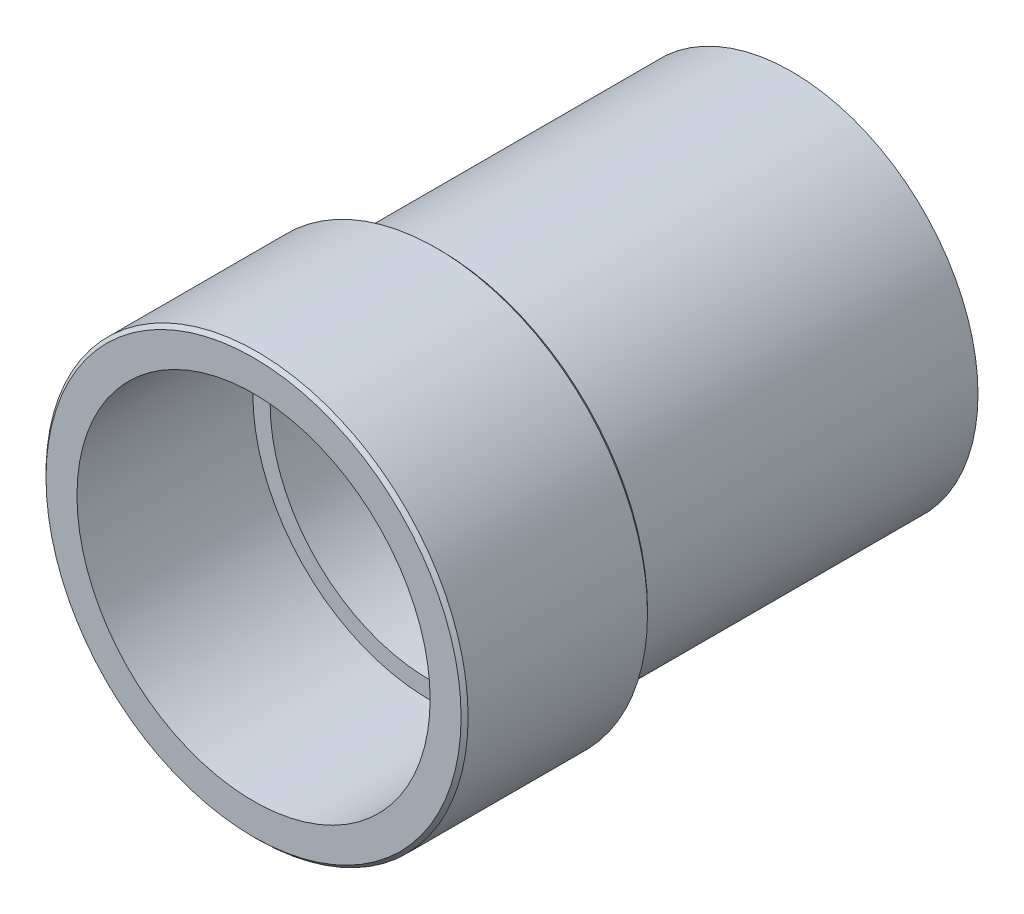
ISO-10303-21;
HEADER;
FILE_DESCRIPTION(('STEP AP214'),'2;1');
FILE_NAME('part.step','',(''),(''),'','','');
FILE_SCHEMA(('AUTOMOTIVE_DESIGN { 1 0 10303 214 1 1 1 1 }'));
ENDSEC;
DATA;
#1=APPLICATION_CONTEXT('core data for automotive mechanical design processes');
#2=APPLICATION_PROTOCOL_DEFINITION('international standard','automotive_design',2000,#1);
#3=PRODUCT_CONTEXT('',#1,'mechanical');
#4=PRODUCT('Part','Part','',(#3));
#5=PRODUCT_RELATED_PRODUCT_CATEGORY('part','',(#4));
#6=PRODUCT_DEFINITION_FORMATION('','',#4);
#7=PRODUCT_DEFINITION_CONTEXT('part definition',#1,'design');
#8=PRODUCT_DEFINITION('design','',#6,#7);
#9=PRODUCT_DEFINITION_SHAPE('','',#8);
#10=(LENGTH_UNIT() NAMED_UNIT(*) SI_UNIT(.MILLI.,.METRE.));
#11=(NAMED_UNIT(*) PLANE_ANGLE_UNIT() SI_UNIT($,.RADIAN.));
#12=(NAMED_UNIT(*) SI_UNIT($,.STERADIAN.) SOLID_ANGLE_UNIT());
#13=UNCERTAINTY_MEASURE_WITH_UNIT(LENGTH_MEASURE(1.E-05),#10,'distance_accuracy_value','');
#14=(GEOMETRIC_REPRESENTATION_CONTEXT(3) GLOBAL_UNCERTAINTY_ASSIGNED_CONTEXT((#13)) GLOBAL_UNIT_ASSIGNED_CONTEXT((#10,
#11,#12)) REPRESENTATION_CONTEXT('',''));
#15=CARTESIAN_POINT('',(0.,0.,0.));
#16=DIRECTION('',(0.,0.,1.));
#17=DIRECTION('',(1.,0.,0.));
#18=AXIS2_PLACEMENT_3D('',#15,#16,#17);
#19=CARTESIAN_POINT('',(0.,12.461875,-12.7));
#20=DIRECTION('',(0.,0.,1.));
#21=DIRECTION('',(1.,0.,0.));
#22=AXIS2_PLACEMENT_3D('',#19,#20,#21);
#23=PLANE('',#22);
#24=CARTESIAN_POINT('',(0.,0.396874999999997,-12.7));
#25=DIRECTION('',(0.,0.,1.));
#26=DIRECTION('',(1.,0.,0.));
#27=AXIS2_PLACEMENT_3D('',#24,#25,#26);
#28=CIRCLE('',#27,12.75);
#29=CARTESIAN_POINT('',(12.75,0.396874999999997,-12.7));
#30=VERTEX_POINT('',#29);
#31=EDGE_CURVE('E43',#30,#30,#28,.T.);
#32=ORIENTED_EDGE('',*,*,#31,.T.);
#33=EDGE_LOOP('',(#32));
#34=FACE_BOUND('',#33,.T.);
#35=CARTESIAN_POINT('',(0.,0.396874999999996,-12.7));
#36=DIRECTION('',(0.,0.,1.));
#37=DIRECTION('',(1.,0.,0.));
#38=AXIS2_PLACEMENT_3D('',#35,#36,#37);
#39=CIRCLE('',#38,11.5);
#40=CARTESIAN_POINT('',(11.5,0.396874999999996,-12.7));
#41=VERTEX_POINT('',#40);
#42=EDGE_CURVE('E75',#41,#41,#39,.T.);
#43=ORIENTED_EDGE('',*,*,#42,.F.);
#44=EDGE_LOOP('',(#43));
#45=FACE_BOUND('',#44,.T.);
#46=ADVANCED_FACE('F39',(#34,#45),#23,.T.);
#47=CARTESIAN_POINT('',(0.,0.396874999999997,0.));
#48=DIRECTION('',(0.,0.,1.));
#49=DIRECTION('',(1.,0.,0.));
#50=AXIS2_PLACEMENT_3D('',#47,#48,#49);
#51=CYLINDRICAL_SURFACE('',#50,15.24);
#52=CARTESIAN_POINT('',(0.,0.396874999999997,-0.254000000000004));
#53=DIRECTION('',(0.,0.,1.));
#54=DIRECTION('',(1.,0.,0.));
#55=AXIS2_PLACEMENT_3D('',#52,#53,#54);
#56=CIRCLE('',#55,15.24);
#57=CARTESIAN_POINT('',(15.24,0.396874999999998,-0.254000000000006));
#58=VERTEX_POINT('',#57);
#59=EDGE_CURVE('E52',#58,#58,#56,.F.);
#60=ORIENTED_EDGE('',*,*,#59,.T.);
#61=EDGE_LOOP('',(#60));
#62=FACE_BOUND('',#61,.T.);
#63=CARTESIAN_POINT('',(0.,0.396874999999997,-13.208));
#64=DIRECTION('',(0.,0.,-1.));
#65=DIRECTION('',(-1.,0.,0.));
#66=AXIS2_PLACEMENT_3D('',#63,#64,#65);
#67=CIRCLE('',#66,15.24);
#68=CARTESIAN_POINT('',(-15.24,0.396874999999997,-13.208));
#69=VERTEX_POINT('',#68);
#70=EDGE_CURVE('E58',#69,#69,#67,.F.);
#71=ORIENTED_EDGE('',*,*,#70,.T.);
#72=EDGE_LOOP('',(#71));
#73=FACE_BOUND('',#72,.T.);
#74=ADVANCED_FACE('F82',(#62,#73),#51,.T.);
#75=CARTESIAN_POINT('',(0.,15.636875,-13.462));
#76=DIRECTION('',(0.,0.,-1.));
#77=DIRECTION('',(-1.,0.,0.));
#78=AXIS2_PLACEMENT_3D('',#75,#76,#77);
#79=PLANE('',#78);
#80=CARTESIAN_POINT('',(0.,0.396874999999997,-13.462));
#81=DIRECTION('',(0.,0.,-1.));
#82=DIRECTION('',(-1.,0.,0.));
#83=AXIS2_PLACEMENT_3D('',#80,#81,#82);
#84=CIRCLE('',#83,13.45);
#85=CARTESIAN_POINT('',(-13.45,0.396874999999997,-13.462));
#86=VERTEX_POINT('',#85);
#87=EDGE_CURVE('E10',#86,#86,#84,.T.);
#88=ORIENTED_EDGE('',*,*,#87,.F.);
#89=EDGE_LOOP('',(#88));
#90=FACE_BOUND('',#89,.T.);
#91=CARTESIAN_POINT('',(0.,0.396874999999997,-13.462));
#92=DIRECTION('',(0.,0.,-1.));
#93=DIRECTION('',(-1.,0.,0.));
#94=AXIS2_PLACEMENT_3D('',#91,#92,#93);
#95=CIRCLE('',#94,14.986);
#96=CARTESIAN_POINT('',(-14.986,0.396874999999997,-13.462));
#97=VERTEX_POINT('',#96);
#98=EDGE_CURVE('E47',#97,#97,#95,.T.);
#99=ORIENTED_EDGE('',*,*,#98,.T.);
#100=EDGE_LOOP('',(#99));
#101=FACE_BOUND('',#100,.T.);
#102=ADVANCED_FACE('F90',(#90,#101),#79,.T.);
#103=CARTESIAN_POINT('',(0.,0.396874999999997,0.));
#104=DIRECTION('',(0.,0.,-1.));
#105=DIRECTION('',(-1.,0.,0.));
#106=AXIS2_PLACEMENT_3D('',#103,#104,#105);
#107=CONICAL_SURFACE('',#106,14.986,0.785398163397455);
#108=ORIENTED_EDGE('',*,*,#59,.F.);
#109=EDGE_LOOP('',(#108));
#110=FACE_BOUND('',#109,.T.);
#111=CARTESIAN_POINT('',(0.,0.396874999999997,0.));
#112=DIRECTION('',(0.,0.,1.));
#113=DIRECTION('',(1.,0.,0.));
#114=AXIS2_PLACEMENT_3D('',#111,#112,#113);
#115=CIRCLE('',#114,14.986);
#116=CARTESIAN_POINT('',(14.986,0.396874999999998,0.));
#117=VERTEX_POINT('',#116);
#118=EDGE_CURVE('E62',#117,#117,#115,.T.);
#119=ORIENTED_EDGE('',*,*,#118,.F.);
#120=EDGE_LOOP('',(#119));
#121=FACE_BOUND('',#120,.T.);
#122=ADVANCED_FACE('F104',(#110,#121),#107,.T.);
#123=CARTESIAN_POINT('',(0.,0.396874999999997,-13.208));
#124=DIRECTION('',(0.,0.,1.));
#125=DIRECTION('',(1.,0.,0.));
#126=AXIS2_PLACEMENT_3D('',#123,#124,#125);
#127=CONICAL_SURFACE('',#126,15.24,0.785398163397459);
#128=ORIENTED_EDGE('',*,*,#98,.F.);
#129=EDGE_LOOP('',(#128));
#130=FACE_BOUND('',#129,.T.);
#131=ORIENTED_EDGE('',*,*,#70,.F.);
#132=EDGE_LOOP('',(#131));
#133=FACE_BOUND('',#132,.T.);
#134=ADVANCED_FACE('F41',(#130,#133),#127,.T.);
#135=CARTESIAN_POINT('',(0.,15.636875,0.));
#136=DIRECTION('',(0.,0.,1.));
#137=DIRECTION('',(1.,0.,0.));
#138=AXIS2_PLACEMENT_3D('',#135,#136,#137);
#139=PLANE('',#138);
#140=ORIENTED_EDGE('',*,*,#118,.T.);
#141=EDGE_LOOP('',(#140));
#142=FACE_BOUND('',#141,.T.);
#143=CARTESIAN_POINT('',(0.,0.396874999999997,0.));
#144=DIRECTION('',(0.,0.,1.));
#145=DIRECTION('',(1.,0.,0.));
#146=AXIS2_PLACEMENT_3D('',#143,#144,#145);
#147=CIRCLE('',#146,12.75);
#148=CARTESIAN_POINT('',(12.75,0.396874999999997,0.));
#149=VERTEX_POINT('',#148);
#150=EDGE_CURVE('E72',#149,#149,#147,.T.);
#151=ORIENTED_EDGE('',*,*,#150,.F.);
#152=EDGE_LOOP('',(#151));
#153=FACE_BOUND('',#152,.T.);
#154=ADVANCED_FACE('F107',(#142,#153),#139,.T.);
#155=CARTESIAN_POINT('',(0.,0.396874999999999,24.5803448278363));
#156=DIRECTION('',(0.,0.,-1.));
#157=DIRECTION('',(-1.,0.,0.));
#158=AXIS2_PLACEMENT_3D('',#155,#156,#157);
#159=CYLINDRICAL_SURFACE('',#158,13.45);
#160=ORIENTED_EDGE('',*,*,#87,.T.);
#161=EDGE_LOOP('',(#160));
#162=FACE_BOUND('',#161,.T.);
#163=CARTESIAN_POINT('',(0.,0.396874999999996,-38.862));
#164=DIRECTION('',(0.,0.,-1.));
#165=DIRECTION('',(-1.,0.,0.));
#166=AXIS2_PLACEMENT_3D('',#163,#164,#165);
#167=CIRCLE('',#166,13.45);
#168=CARTESIAN_POINT('',(-13.45,0.396874999999996,-38.862));
#169=VERTEX_POINT('',#168);
#170=EDGE_CURVE('E66',#169,#169,#167,.T.);
#171=ORIENTED_EDGE('',*,*,#170,.F.);
#172=EDGE_LOOP('',(#171));
#173=FACE_BOUND('',#172,.T.);
#174=ADVANCED_FACE('F96',(#162,#173),#159,.T.);
#175=CARTESIAN_POINT('',(0.,0.396874999999999,24.5803448278363));
#176=DIRECTION('',(0.,0.,-1.));
#177=DIRECTION('',(-1.,0.,0.));
#178=AXIS2_PLACEMENT_3D('',#175,#176,#177);
#179=CYLINDRICAL_SURFACE('',#178,11.5);
#180=CARTESIAN_POINT('',(0.,0.396874999999996,-38.862));
#181=DIRECTION('',(0.,0.,-1.));
#182=DIRECTION('',(-1.,0.,0.));
#183=AXIS2_PLACEMENT_3D('',#180,#181,#182);
#184=CIRCLE('',#183,11.5);
#185=CARTESIAN_POINT('',(-11.5,0.396874999999996,-38.862));
#186=VERTEX_POINT('',#185);
#187=EDGE_CURVE('E69',#186,#186,#184,.T.);
#188=ORIENTED_EDGE('',*,*,#187,.T.);
#189=EDGE_LOOP('',(#188));
#190=FACE_BOUND('',#189,.T.);
#191=ORIENTED_EDGE('',*,*,#42,.T.);
#192=EDGE_LOOP('',(#191));
#193=FACE_BOUND('',#192,.T.);
#194=ADVANCED_FACE('F79',(#190,#193),#179,.F.);
#195=CARTESIAN_POINT('',(0.,13.541375,-38.862));
#196=DIRECTION('',(0.,0.,-1.));
#197=DIRECTION('',(-1.,0.,0.));
#198=AXIS2_PLACEMENT_3D('',#195,#196,#197);
#199=PLANE('',#198);
#200=ORIENTED_EDGE('',*,*,#170,.T.);
#201=EDGE_LOOP('',(#200));
#202=FACE_BOUND('',#201,.T.);
#203=ORIENTED_EDGE('',*,*,#187,.F.);
#204=EDGE_LOOP('',(#203));
#205=FACE_BOUND('',#204,.T.);
#206=ADVANCED_FACE('F98',(#202,#205),#199,.T.);
#207=CARTESIAN_POINT('',(0.,0.396874999999997,-55.8488088914464));
#208=DIRECTION('',(0.,0.,1.));
#209=DIRECTION('',(1.,0.,0.));
#210=AXIS2_PLACEMENT_3D('',#207,#208,#209);
#211=CYLINDRICAL_SURFACE('',#210,12.75);
#212=CARTESIAN_POINT('',(12.75,0.396874999999997,-12.7));
#213=CARTESIAN_POINT('',(12.75,0.396874999999997,-12.5677083333333));
#214=CARTESIAN_POINT('',(12.75,0.396874999999997,-12.4354166666667));
#215=CARTESIAN_POINT('',(12.75,0.396874999999997,-12.1708333333333));
#216=CARTESIAN_POINT('',(12.75,0.396874999999997,-12.0385416666667));
#217=CARTESIAN_POINT('',(12.75,0.396874999999997,-11.7739583333333));
#218=CARTESIAN_POINT('',(12.75,0.396874999999997,-11.6416666666667));
#219=CARTESIAN_POINT('',(12.75,0.396874999999997,-11.3770833333333));
#220=CARTESIAN_POINT('',(12.75,0.396874999999997,-11.2447916666667));
#221=CARTESIAN_POINT('',(12.75,0.396874999999997,-10.9802083333333));
#222=CARTESIAN_POINT('',(12.75,0.396874999999997,-10.8479166666667));
#223=CARTESIAN_POINT('',(12.75,0.396874999999997,-10.5833333333333));
#224=CARTESIAN_POINT('',(12.75,0.396874999999997,-10.4510416666667));
#225=CARTESIAN_POINT('',(12.75,0.396874999999997,-10.1864583333333));
#226=CARTESIAN_POINT('',(12.75,0.396874999999997,-10.0541666666667));
#227=CARTESIAN_POINT('',(12.75,0.396874999999997,-9.78958333333335));
#228=CARTESIAN_POINT('',(12.75,0.396874999999997,-9.65729166666668));
#229=CARTESIAN_POINT('',(12.75,0.396874999999997,-9.39270833333335));
#230=CARTESIAN_POINT('',(12.75,0.396874999999997,-9.26041666666667));
#231=CARTESIAN_POINT('',(12.75,0.396874999999997,-8.99583333333334));
#232=CARTESIAN_POINT('',(12.75,0.396874999999997,-8.86354166666668));
#233=CARTESIAN_POINT('',(12.75,0.396874999999997,-8.59895833333334));
#234=CARTESIAN_POINT('',(12.75,0.396874999999997,-8.46666666666668));
#235=CARTESIAN_POINT('',(12.75,0.396874999999997,-8.20208333333334));
#236=CARTESIAN_POINT('',(12.75,0.396874999999997,-8.06979166666667));
#237=CARTESIAN_POINT('',(12.75,0.396874999999997,-7.80520833333334));
#238=CARTESIAN_POINT('',(12.75,0.396874999999997,-7.67291666666668));
#239=CARTESIAN_POINT('',(12.75,0.396874999999997,-7.40833333333334));
#240=CARTESIAN_POINT('',(12.75,0.396874999999997,-7.27604166666668));
#241=CARTESIAN_POINT('',(12.75,0.396874999999997,-7.01145833333334));
#242=CARTESIAN_POINT('',(12.75,0.396874999999997,-6.87916666666668));
#243=CARTESIAN_POINT('',(12.75,0.396874999999997,-6.61458333333334));
#244=CARTESIAN_POINT('',(12.75,0.396874999999997,-6.48229166666667));
#245=CARTESIAN_POINT('',(12.75,0.396874999999997,-6.21770833333334));
#246=CARTESIAN_POINT('',(12.75,0.396874999999997,-6.08541666666668));
#247=CARTESIAN_POINT('',(12.75,0.396874999999997,-5.82083333333334));
#248=CARTESIAN_POINT('',(12.75,0.396874999999997,-5.68854166666667));
#249=CARTESIAN_POINT('',(12.75,0.396874999999997,-5.42395833333334));
#250=CARTESIAN_POINT('',(12.75,0.396874999999997,-5.29166666666667));
#251=CARTESIAN_POINT('',(12.75,0.396874999999997,-5.02708333333334));
#252=CARTESIAN_POINT('',(12.75,0.396874999999997,-4.89479166666668));
#253=CARTESIAN_POINT('',(12.75,0.396874999999997,-4.63020833333334));
#254=CARTESIAN_POINT('',(12.75,0.396874999999997,-4.49791666666667));
#255=CARTESIAN_POINT('',(12.75,0.396874999999997,-4.23333333333334));
#256=CARTESIAN_POINT('',(12.75,0.396874999999997,-4.10104166666667));
#257=CARTESIAN_POINT('',(12.75,0.396874999999997,-3.83645833333334));
#258=CARTESIAN_POINT('',(12.75,0.396874999999997,-3.70416666666668));
#259=CARTESIAN_POINT('',(12.75,0.396874999999997,-3.43958333333334));
#260=CARTESIAN_POINT('',(12.75,0.396874999999997,-3.30729166666667));
#261=CARTESIAN_POINT('',(12.75,0.396874999999997,-3.04270833333334));
#262=CARTESIAN_POINT('',(12.75,0.396874999999997,-2.91041666666667));
#263=CARTESIAN_POINT('',(12.75,0.396874999999997,-2.64583333333334));
#264=CARTESIAN_POINT('',(12.75,0.396874999999997,-2.51354166666667));
#265=CARTESIAN_POINT('',(12.75,0.396874999999997,-2.24895833333334));
#266=CARTESIAN_POINT('',(12.75,0.396874999999997,-2.11666666666667));
#267=CARTESIAN_POINT('',(12.75,0.396874999999997,-1.85208333333334));
#268=CARTESIAN_POINT('',(12.75,0.396874999999997,-1.71979166666667));
#269=CARTESIAN_POINT('',(12.75,0.396874999999997,-1.45520833333334));
#270=CARTESIAN_POINT('',(12.75,0.396874999999997,-1.32291666666667));
#271=CARTESIAN_POINT('',(12.75,0.396874999999997,-1.05833333333334));
#272=CARTESIAN_POINT('',(12.75,0.396874999999997,-0.926041666666671));
#273=CARTESIAN_POINT('',(12.75,0.396874999999997,-0.661458333333337));
#274=CARTESIAN_POINT('',(12.75,0.396874999999997,-0.529166666666671));
#275=CARTESIAN_POINT('',(12.75,0.396874999999997,-0.264583333333339));
#276=CARTESIAN_POINT('',(12.75,0.396874999999997,-0.132291666666673));
#277=CARTESIAN_POINT('',(12.75,0.396874999999997,0.));
#278=B_SPLINE_CURVE_WITH_KNOTS('',3,(#212,#213,#214,#215,#216,#217,#218,#219,#220,#221,#222,
#223,#224,#225,#226,#227,#228,#229,#230,#231,#232,#233,#234,#235,#236,#237,#238,#239,#240,#241,
#242,#243,#244,#245,#246,#247,#248,#249,#250,#251,#252,#253,#254,#255,#256,#257,#258,#259,#260,
#261,#262,#263,#264,#265,#266,#267,#268,#269,#270,#271,#272,#273,#274,#275,#276,#277),
.UNSPECIFIED.,.F.,.F.,(4,2,2,2,2,2,2,2,2,2,2,2,2,2,2,2,2,2,2,2,2,2,2,2,2,2,2,2,2,2,2,2,4),(0.,
0.396874999999998,0.793750000000003,1.190625,1.5875,1.984375,2.38125,2.778125,3.175,3.571875,
3.96875,4.365625,4.7625,5.159375,5.55625,5.953125,6.35,6.746875,7.14375,7.540625,7.9375,
8.334375,8.73125,9.128125,9.52500000000001,9.921875,10.31875,10.715625,11.1125,11.509375,
11.90625,12.303125,12.7),.UNSPECIFIED.);
#279=EDGE_CURVE('BSEAM101',#30,#149,#278,.T.);
#280=ORIENTED_EDGE('',*,*,#31,.F.);
#281=ORIENTED_EDGE('',*,*,#150,.T.);
#282=ORIENTED_EDGE('',*,*,#279,.T.);
#283=ORIENTED_EDGE('',*,*,#279,.F.);
#284=EDGE_LOOP('',(#280,#282,#281,#283));
#285=FACE_BOUND('',#284,.T.);
#286=ADVANCED_FACE('F101',(#285),#211,.F.);
#287=CLOSED_SHELL('',(#46,#74,#102,#122,#134,#154,#174,#194,#206,#286));
#288=MANIFOLD_SOLID_BREP('B2',#287);
#289=ADVANCED_BREP_SHAPE_REPRESENTATION('',(#18,#288),#14);
#290=SHAPE_DEFINITION_REPRESENTATION(#9,#289);
ENDSEC;
END-ISO-10303-21;
